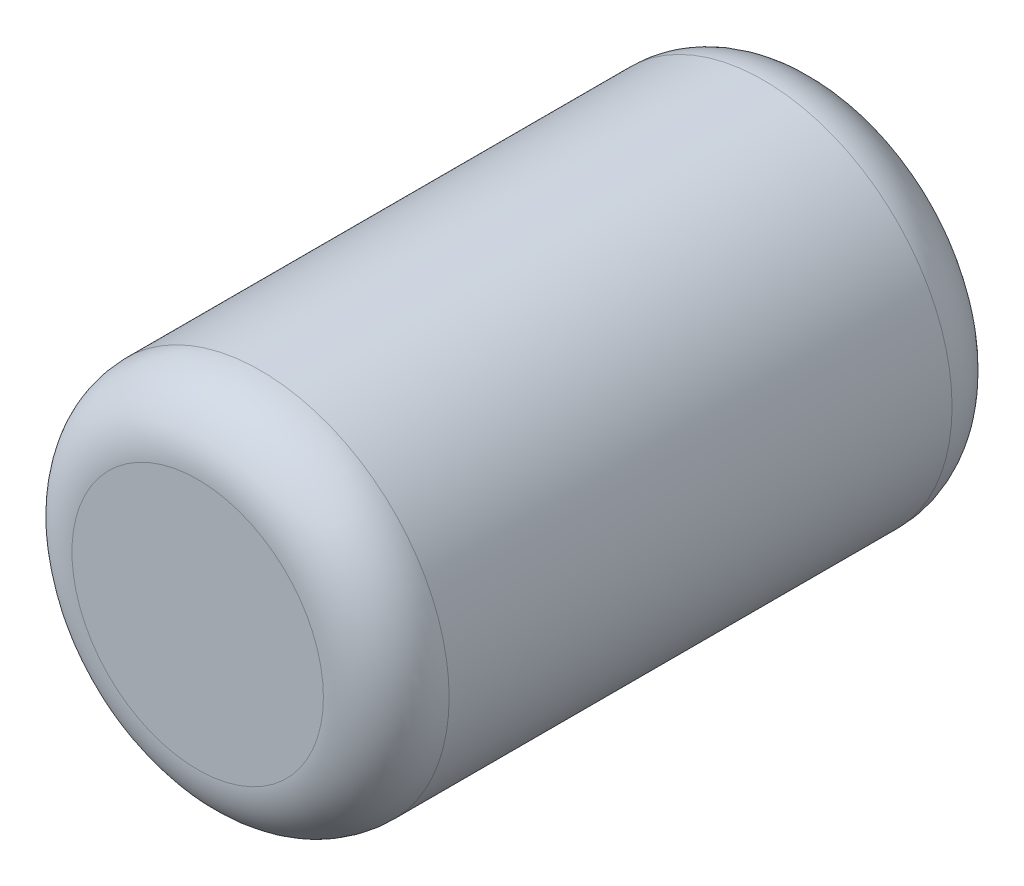
ISO-10303-21;
HEADER;
FILE_DESCRIPTION(('STEP AP214'),'2;1');
FILE_NAME('part.step','',(''),(''),'','','');
FILE_SCHEMA(('AUTOMOTIVE_DESIGN { 1 0 10303 214 1 1 1 1 }'));
ENDSEC;
DATA;
#1=APPLICATION_CONTEXT('core data for automotive mechanical design processes');
#2=APPLICATION_PROTOCOL_DEFINITION('international standard','automotive_design',2000,#1);
#3=PRODUCT_CONTEXT('',#1,'mechanical');
#4=PRODUCT('Part','Part','',(#3));
#5=PRODUCT_RELATED_PRODUCT_CATEGORY('part','',(#4));
#6=PRODUCT_DEFINITION_FORMATION('','',#4);
#7=PRODUCT_DEFINITION_CONTEXT('part definition',#1,'design');
#8=PRODUCT_DEFINITION('design','',#6,#7);
#9=PRODUCT_DEFINITION_SHAPE('','',#8);
#10=(LENGTH_UNIT() NAMED_UNIT(*) SI_UNIT(.MILLI.,.METRE.));
#11=(NAMED_UNIT(*) PLANE_ANGLE_UNIT() SI_UNIT($,.RADIAN.));
#12=(NAMED_UNIT(*) SI_UNIT($,.STERADIAN.) SOLID_ANGLE_UNIT());
#13=UNCERTAINTY_MEASURE_WITH_UNIT(LENGTH_MEASURE(1.E-05),#10,'distance_accuracy_value','');
#14=(GEOMETRIC_REPRESENTATION_CONTEXT(3) GLOBAL_UNCERTAINTY_ASSIGNED_CONTEXT((#13)) GLOBAL_UNIT_ASSIGNED_CONTEXT((#10,
#11,#12)) REPRESENTATION_CONTEXT('',''));
#15=CARTESIAN_POINT('',(0.,0.,0.));
#16=DIRECTION('',(0.,0.,1.));
#17=DIRECTION('',(1.,0.,0.));
#18=AXIS2_PLACEMENT_3D('',#15,#16,#17);
#19=CARTESIAN_POINT('',(0.,0.,30.));
#20=DIRECTION('',(0.,0.,-1.));
#21=DIRECTION('',(-1.,0.,0.));
#22=AXIS2_PLACEMENT_3D('',#19,#20,#21);
#23=CYLINDRICAL_SURFACE('',#22,9.);
#24=CARTESIAN_POINT('',(0.,0.,27.));
#25=DIRECTION('',(0.,0.,1.));
#26=DIRECTION('',(1.,0.,0.));
#27=AXIS2_PLACEMENT_3D('',#24,#25,#26);
#28=CIRCLE('',#27,9.);
#29=CARTESIAN_POINT('',(9.,0.,27.));
#30=VERTEX_POINT('',#29);
#31=EDGE_CURVE('E46',#30,#30,#28,.F.);
#32=ORIENTED_EDGE('',*,*,#31,.T.);
#33=EDGE_LOOP('',(#32));
#34=FACE_BOUND('',#33,.T.);
#35=CARTESIAN_POINT('',(0.,0.,3.));
#36=DIRECTION('',(0.,0.,1.));
#37=DIRECTION('',(1.,0.,0.));
#38=AXIS2_PLACEMENT_3D('',#35,#36,#37);
#39=CIRCLE('',#38,9.);
#40=CARTESIAN_POINT('',(9.,0.,3.));
#41=VERTEX_POINT('',#40);
#42=EDGE_CURVE('E52',#41,#41,#39,.T.);
#43=ORIENTED_EDGE('',*,*,#42,.T.);
#44=EDGE_LOOP('',(#43));
#45=FACE_BOUND('',#44,.T.);
#46=ADVANCED_FACE('F38',(#34,#45),#23,.T.);
#47=CARTESIAN_POINT('',(0.,0.,30.));
#48=DIRECTION('',(0.,0.,1.));
#49=DIRECTION('',(1.,0.,0.));
#50=AXIS2_PLACEMENT_3D('',#47,#48,#49);
#51=PLANE('',#50);
#52=CARTESIAN_POINT('',(0.,0.,30.));
#53=DIRECTION('',(0.,0.,1.));
#54=DIRECTION('',(1.,0.,0.));
#55=AXIS2_PLACEMENT_3D('',#52,#53,#54);
#56=CIRCLE('',#55,6.);
#57=CARTESIAN_POINT('',(6.,0.,30.));
#58=VERTEX_POINT('',#57);
#59=EDGE_CURVE('E57',#58,#58,#56,.T.);
#60=ORIENTED_EDGE('',*,*,#59,.T.);
#61=EDGE_LOOP('',(#60));
#62=FACE_BOUND('',#61,.T.);
#63=ADVANCED_FACE('F63',(#62),#51,.T.);
#64=CARTESIAN_POINT('',(0.,0.,0.));
#65=DIRECTION('',(0.,0.,1.));
#66=DIRECTION('',(1.,0.,0.));
#67=AXIS2_PLACEMENT_3D('',#64,#65,#66);
#68=PLANE('',#67);
#69=CARTESIAN_POINT('',(0.,0.,0.));
#70=DIRECTION('',(0.,0.,1.));
#71=DIRECTION('',(1.,0.,0.));
#72=AXIS2_PLACEMENT_3D('',#69,#70,#71);
#73=CIRCLE('',#72,6.);
#74=CARTESIAN_POINT('',(6.,0.,0.));
#75=VERTEX_POINT('',#74);
#76=EDGE_CURVE('E10',#75,#75,#73,.F.);
#77=ORIENTED_EDGE('',*,*,#76,.T.);
#78=EDGE_LOOP('',(#77));
#79=FACE_BOUND('',#78,.T.);
#80=ADVANCED_FACE('F67',(#79),#68,.F.);
#81=CARTESIAN_POINT('',(0.,0.,27.));
#82=DIRECTION('',(0.,0.,1.));
#83=DIRECTION('',(1.,0.,0.));
#84=AXIS2_PLACEMENT_3D('',#81,#82,#83);
#85=TOROIDAL_SURFACE('',#84,6.,3.);
#86=ORIENTED_EDGE('',*,*,#31,.F.);
#87=EDGE_LOOP('',(#86));
#88=FACE_BOUND('',#87,.T.);
#89=ORIENTED_EDGE('',*,*,#59,.F.);
#90=EDGE_LOOP('',(#89));
#91=FACE_BOUND('',#90,.T.);
#92=ADVANCED_FACE('F65',(#88,#91),#85,.T.);
#93=CARTESIAN_POINT('',(0.,0.,3.));
#94=DIRECTION('',(0.,0.,1.));
#95=DIRECTION('',(1.,0.,0.));
#96=AXIS2_PLACEMENT_3D('',#93,#94,#95);
#97=TOROIDAL_SURFACE('',#96,6.,3.);
#98=ORIENTED_EDGE('',*,*,#76,.F.);
#99=EDGE_LOOP('',(#98));
#100=FACE_BOUND('',#99,.T.);
#101=ORIENTED_EDGE('',*,*,#42,.F.);
#102=EDGE_LOOP('',(#101));
#103=FACE_BOUND('',#102,.T.);
#104=ADVANCED_FACE('F40',(#100,#103),#97,.T.);
#105=CLOSED_SHELL('',(#46,#63,#80,#92,#104));
#106=MANIFOLD_SOLID_BREP('B2',#105);
#107=ADVANCED_BREP_SHAPE_REPRESENTATION('',(#18,#106),#14);
#108=SHAPE_DEFINITION_REPRESENTATION(#9,#107);
ENDSEC;
END-ISO-10303-21;
